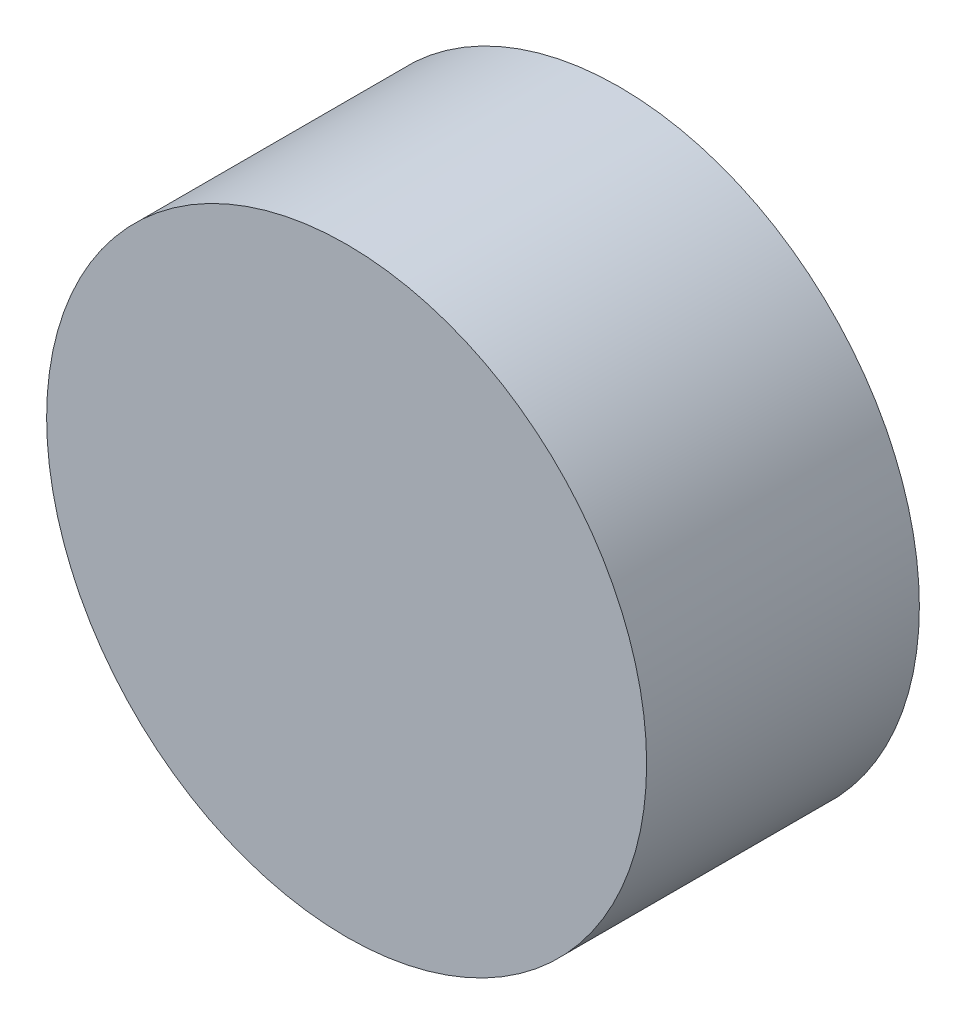
ISO-10303-21;
HEADER;
FILE_DESCRIPTION(('STEP AP214'),'2;1');
FILE_NAME('part.step','',(''),(''),'','','');
FILE_SCHEMA(('AUTOMOTIVE_DESIGN { 1 0 10303 214 1 1 1 1 }'));
ENDSEC;
DATA;
#1=APPLICATION_CONTEXT('core data for automotive mechanical design processes');
#2=APPLICATION_PROTOCOL_DEFINITION('international standard','automotive_design',2000,#1);
#3=PRODUCT_CONTEXT('',#1,'mechanical');
#4=PRODUCT('Part','Part','',(#3));
#5=PRODUCT_RELATED_PRODUCT_CATEGORY('part','',(#4));
#6=PRODUCT_DEFINITION_FORMATION('','',#4);
#7=PRODUCT_DEFINITION_CONTEXT('part definition',#1,'design');
#8=PRODUCT_DEFINITION('design','',#6,#7);
#9=PRODUCT_DEFINITION_SHAPE('','',#8);
#10=(LENGTH_UNIT() NAMED_UNIT(*) SI_UNIT(.MILLI.,.METRE.));
#11=(NAMED_UNIT(*) PLANE_ANGLE_UNIT() SI_UNIT($,.RADIAN.));
#12=(NAMED_UNIT(*) SI_UNIT($,.STERADIAN.) SOLID_ANGLE_UNIT());
#13=UNCERTAINTY_MEASURE_WITH_UNIT(LENGTH_MEASURE(1.E-05),#10,'distance_accuracy_value','');
#14=(GEOMETRIC_REPRESENTATION_CONTEXT(3) GLOBAL_UNCERTAINTY_ASSIGNED_CONTEXT((#13)) GLOBAL_UNIT_ASSIGNED_CONTEXT((#10,
#11,#12)) REPRESENTATION_CONTEXT('',''));
#15=CARTESIAN_POINT('',(0.,0.,0.));
#16=DIRECTION('',(0.,0.,1.));
#17=DIRECTION('',(1.,0.,0.));
#18=AXIS2_PLACEMENT_3D('',#15,#16,#17);
#19=CARTESIAN_POINT('',(0.,0.,20.));
#20=DIRECTION('',(0.,0.,-1.));
#21=DIRECTION('',(-1.,0.,0.));
#22=AXIS2_PLACEMENT_3D('',#19,#20,#21);
#23=CYLINDRICAL_SURFACE('',#22,22.);
#24=CARTESIAN_POINT('',(0.,0.,20.));
#25=DIRECTION('',(0.,0.,1.));
#26=DIRECTION('',(1.,0.,0.));
#27=AXIS2_PLACEMENT_3D('',#24,#25,#26);
#28=CIRCLE('',#27,22.);
#29=CARTESIAN_POINT('',(22.,0.,20.));
#30=VERTEX_POINT('',#29);
#31=EDGE_CURVE('E10',#30,#30,#28,.T.);
#32=ORIENTED_EDGE('',*,*,#31,.F.);
#33=EDGE_LOOP('',(#32));
#34=FACE_BOUND('',#33,.T.);
#35=CARTESIAN_POINT('',(0.,0.,0.));
#36=DIRECTION('',(0.,0.,1.));
#37=DIRECTION('',(1.,0.,0.));
#38=AXIS2_PLACEMENT_3D('',#35,#36,#37);
#39=CIRCLE('',#38,22.);
#40=CARTESIAN_POINT('',(22.,0.,0.));
#41=VERTEX_POINT('',#40);
#42=EDGE_CURVE('E38',#41,#41,#39,.T.);
#43=ORIENTED_EDGE('',*,*,#42,.T.);
#44=EDGE_LOOP('',(#43));
#45=FACE_BOUND('',#44,.T.);
#46=ADVANCED_FACE('F35',(#34,#45),#23,.T.);
#47=CARTESIAN_POINT('',(0.,0.,20.));
#48=DIRECTION('',(0.,0.,1.));
#49=DIRECTION('',(1.,0.,0.));
#50=AXIS2_PLACEMENT_3D('',#47,#48,#49);
#51=PLANE('',#50);
#52=ORIENTED_EDGE('',*,*,#31,.T.);
#53=EDGE_LOOP('',(#52));
#54=FACE_BOUND('',#53,.T.);
#55=ADVANCED_FACE('F50',(#54),#51,.T.);
#56=CARTESIAN_POINT('',(0.,0.,0.));
#57=DIRECTION('',(0.,0.,1.));
#58=DIRECTION('',(1.,0.,0.));
#59=AXIS2_PLACEMENT_3D('',#56,#57,#58);
#60=PLANE('',#59);
#61=ORIENTED_EDGE('',*,*,#42,.F.);
#62=EDGE_LOOP('',(#61));
#63=FACE_BOUND('',#62,.T.);
#64=ADVANCED_FACE('F48',(#63),#60,.F.);
#65=CLOSED_SHELL('',(#46,#55,#64));
#66=MANIFOLD_SOLID_BREP('B2',#65);
#67=ADVANCED_BREP_SHAPE_REPRESENTATION('',(#18,#66),#14);
#68=SHAPE_DEFINITION_REPRESENTATION(#9,#67);
ENDSEC;
END-ISO-10303-21;
